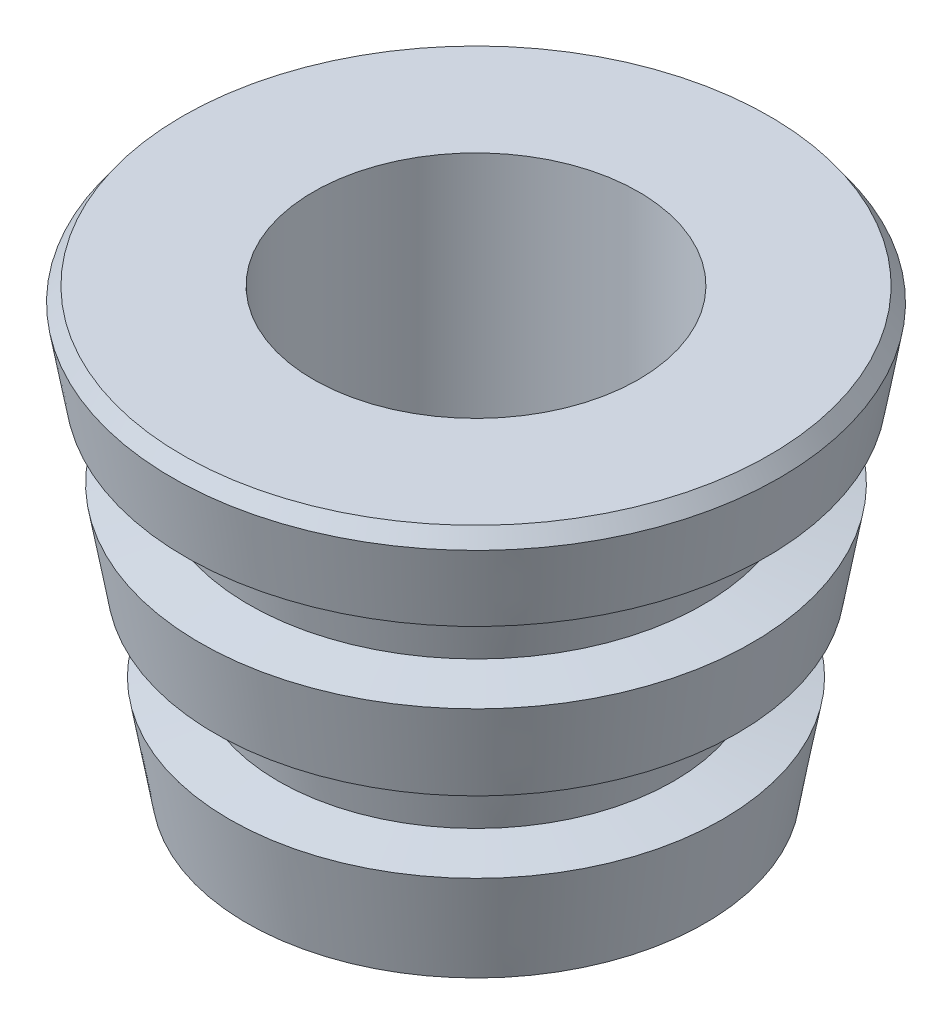
ISO-10303-21;
HEADER;
FILE_DESCRIPTION(('STEP AP214'),'2;1');
FILE_NAME('part.step','',(''),(''),'','','');
FILE_SCHEMA(('AUTOMOTIVE_DESIGN { 1 0 10303 214 1 1 1 1 }'));
ENDSEC;
DATA;
#1=APPLICATION_CONTEXT('core data for automotive mechanical design processes');
#2=APPLICATION_PROTOCOL_DEFINITION('international standard','automotive_design',2000,#1);
#3=PRODUCT_CONTEXT('',#1,'mechanical');
#4=PRODUCT('Part','Part','',(#3));
#5=PRODUCT_RELATED_PRODUCT_CATEGORY('part','',(#4));
#6=PRODUCT_DEFINITION_FORMATION('','',#4);
#7=PRODUCT_DEFINITION_CONTEXT('part definition',#1,'design');
#8=PRODUCT_DEFINITION('design','',#6,#7);
#9=PRODUCT_DEFINITION_SHAPE('','',#8);
#10=(LENGTH_UNIT() NAMED_UNIT(*) SI_UNIT(.MILLI.,.METRE.));
#11=(NAMED_UNIT(*) PLANE_ANGLE_UNIT() SI_UNIT($,.RADIAN.));
#12=(NAMED_UNIT(*) SI_UNIT($,.STERADIAN.) SOLID_ANGLE_UNIT());
#13=UNCERTAINTY_MEASURE_WITH_UNIT(LENGTH_MEASURE(1.E-05),#10,'distance_accuracy_value','');
#14=(GEOMETRIC_REPRESENTATION_CONTEXT(3) GLOBAL_UNCERTAINTY_ASSIGNED_CONTEXT((#13)) GLOBAL_UNIT_ASSIGNED_CONTEXT((#10,
#11,#12)) REPRESENTATION_CONTEXT('',''));
#15=CARTESIAN_POINT('',(0.,0.,0.));
#16=DIRECTION('',(0.,0.,1.));
#17=DIRECTION('',(1.,0.,0.));
#18=AXIS2_PLACEMENT_3D('',#15,#16,#17);
#19=CARTESIAN_POINT('',(0.,0.,0.));
#20=DIRECTION('',(0.,1.,0.));
#21=DIRECTION('',(-1.,0.,0.));
#22=AXIS2_PLACEMENT_3D('',#19,#20,#21);
#23=CONICAL_SURFACE('',#22,10.3596393144852,0.174532925199426);
#24=CARTESIAN_POINT('',(0.,-8.70823082966376,0.));
#25=DIRECTION('',(0.,1.,0.));
#26=DIRECTION('',(-1.,0.,0.));
#27=AXIS2_PLACEMENT_3D('',#24,#25,#26);
#28=CIRCLE('',#27,8.82414326497825);
#29=CARTESIAN_POINT('',(-8.82414326497825,-8.70823082966377,0.));
#30=VERTEX_POINT('',#29);
#31=EDGE_CURVE('E67',#30,#30,#28,.T.);
#32=ORIENTED_EDGE('',*,*,#31,.T.);
#33=EDGE_LOOP('',(#32));
#34=FACE_BOUND('',#33,.T.);
#35=CARTESIAN_POINT('',(0.,-5.79441071848,0.));
#36=DIRECTION('',(0.,1.,0.));
#37=DIRECTION('',(-1.,0.,0.));
#38=AXIS2_PLACEMENT_3D('',#35,#36,#37);
#39=CIRCLE('',#38,9.33792836751087);
#40=CARTESIAN_POINT('',(-9.33792836751087,-5.79441071848,0.));
#41=VERTEX_POINT('',#40);
#42=EDGE_CURVE('E44',#41,#41,#39,.T.);
#43=ORIENTED_EDGE('',*,*,#42,.F.);
#44=EDGE_LOOP('',(#43));
#45=FACE_BOUND('',#44,.T.);
#46=ADVANCED_FACE('F29',(#34,#45),#23,.T.);
#47=CARTESIAN_POINT('',(0.,-5.79441071848,0.));
#48=DIRECTION('',(0.,-1.,0.));
#49=DIRECTION('',(1.,0.,0.));
#50=AXIS2_PLACEMENT_3D('',#47,#48,#49);
#51=CONICAL_SURFACE('',#50,9.33792836751087,1.39626340159547);
#52=CARTESIAN_POINT('',(0.,-5.50268177999957,0.));
#53=DIRECTION('',(0.,1.,0.));
#54=DIRECTION('',(-1.,0.,0.));
#55=AXIS2_PLACEMENT_3D('',#52,#53,#54);
#56=CIRCLE('',#55,7.68345134245036);
#57=CARTESIAN_POINT('',(-7.68345134245036,-5.50268177999957,0.));
#58=VERTEX_POINT('',#57);
#59=EDGE_CURVE('E49',#58,#58,#56,.T.);
#60=ORIENTED_EDGE('',*,*,#59,.F.);
#61=EDGE_LOOP('',(#60));
#62=FACE_BOUND('',#61,.T.);
#63=ORIENTED_EDGE('',*,*,#42,.T.);
#64=EDGE_LOOP('',(#63));
#65=FACE_BOUND('',#64,.T.);
#66=ADVANCED_FACE('F105',(#62,#65),#51,.T.);
#67=CARTESIAN_POINT('',(0.,-5.50268177999957,0.));
#68=DIRECTION('',(0.,1.,0.));
#69=DIRECTION('',(-1.,0.,0.));
#70=AXIS2_PLACEMENT_3D('',#67,#68,#69);
#71=CONICAL_SURFACE('',#70,7.68345134245036,0.174532925199426);
#72=CARTESIAN_POINT('',(0.,-2.74522007156538,0.));
#73=DIRECTION('',(0.,1.,0.));
#74=DIRECTION('',(-1.,0.,0.));
#75=AXIS2_PLACEMENT_3D('',#72,#73,#74);
#76=CIRCLE('',#75,8.16966623991775);
#77=CARTESIAN_POINT('',(-8.16966623991775,-2.74522007156538,0.));
#78=VERTEX_POINT('',#77);
#79=EDGE_CURVE('E52',#78,#78,#76,.T.);
#80=ORIENTED_EDGE('',*,*,#79,.F.);
#81=EDGE_LOOP('',(#80));
#82=FACE_BOUND('',#81,.T.);
#83=ORIENTED_EDGE('',*,*,#59,.T.);
#84=EDGE_LOOP('',(#83));
#85=FACE_BOUND('',#84,.T.);
#86=ADVANCED_FACE('F110',(#82,#85),#71,.T.);
#87=CARTESIAN_POINT('',(0.,-2.74522007156538,0.));
#88=DIRECTION('',(0.,-1.,0.));
#89=DIRECTION('',(1.,0.,0.));
#90=AXIS2_PLACEMENT_3D('',#87,#88,#89);
#91=CONICAL_SURFACE('',#90,8.16966623991775,1.39626340159547);
#92=CARTESIAN_POINT('',(0.,-3.03694901004581,0.));
#93=DIRECTION('',(0.,1.,0.));
#94=DIRECTION('',(-1.,0.,0.));
#95=AXIS2_PLACEMENT_3D('',#92,#93,#94);
#96=CIRCLE('',#95,9.82414326497826);
#97=CARTESIAN_POINT('',(-9.82414326497826,-3.03694901004582,0.));
#98=VERTEX_POINT('',#97);
#99=EDGE_CURVE('E55',#98,#98,#96,.T.);
#100=ORIENTED_EDGE('',*,*,#99,.F.);
#101=EDGE_LOOP('',(#100));
#102=FACE_BOUND('',#101,.T.);
#103=ORIENTED_EDGE('',*,*,#79,.T.);
#104=EDGE_LOOP('',(#103));
#105=FACE_BOUND('',#104,.T.);
#106=ADVANCED_FACE('F135',(#102,#105),#91,.F.);
#107=CARTESIAN_POINT('',(-10.3596393144852,0.,0.));
#108=DIRECTION('',(0.,1.,0.));
#109=DIRECTION('',(-1.,0.,0.));
#110=AXIS2_PLACEMENT_3D('',#107,#108,#109);
#111=PLANE('',#110);
#112=CARTESIAN_POINT('',(0.,0.,0.));
#113=DIRECTION('',(0.,-1.,0.));
#114=DIRECTION('',(1.,0.,0.));
#115=AXIS2_PLACEMENT_3D('',#112,#113,#114);
#116=CIRCLE('',#115,5.5);
#117=CARTESIAN_POINT('',(5.5,0.,0.));
#118=VERTEX_POINT('',#117);
#119=EDGE_CURVE('E70',#118,#118,#116,.T.);
#120=ORIENTED_EDGE('',*,*,#119,.T.);
#121=EDGE_LOOP('',(#120));
#122=FACE_BOUND('',#121,.T.);
#123=CARTESIAN_POINT('',(0.,0.,0.));
#124=DIRECTION('',(0.,1.,0.));
#125=DIRECTION('',(-1.,0.,0.));
#126=AXIS2_PLACEMENT_3D('',#123,#124,#125);
#127=CIRCLE('',#126,9.92803031947846);
#128=CARTESIAN_POINT('',(-9.92803031947846,0.,0.));
#129=VERTEX_POINT('',#128);
#130=EDGE_CURVE('E36',#129,#129,#127,.T.);
#131=ORIENTED_EDGE('',*,*,#130,.T.);
#132=EDGE_LOOP('',(#131));
#133=FACE_BOUND('',#132,.T.);
#134=ADVANCED_FACE('F77',(#122,#133),#111,.T.);
#135=CARTESIAN_POINT('',(0.,-0.492403876506099,0.));
#136=DIRECTION('',(0.,-1.,0.));
#137=DIRECTION('',(1.,0.,0.));
#138=AXIS2_PLACEMENT_3D('',#135,#136,#137);
#139=CIRCLE('',#138,10.2728152256517);
#140=CARTESIAN_POINT('',(10.2728152256517,-0.492403876506098,0.));
#141=VERTEX_POINT('',#140);
#142=EDGE_CURVE('E10',#141,#141,#139,.T.);
#143=ORIENTED_EDGE('',*,*,#142,.T.);
#144=EDGE_LOOP('',(#143));
#145=FACE_BOUND('',#144,.T.);
#146=ORIENTED_EDGE('',*,*,#99,.T.);
#147=EDGE_LOOP('',(#146));
#148=FACE_BOUND('',#147,.T.);
#149=ADVANCED_FACE('F95',(#145,#148),#23,.T.);
#150=CARTESIAN_POINT('',(0.,-8.41650189118333,0.));
#151=DIRECTION('',(0.,-1.,0.));
#152=DIRECTION('',(1.,0.,0.));
#153=AXIS2_PLACEMENT_3D('',#150,#151,#152);
#154=CONICAL_SURFACE('',#153,7.16966623991774,1.39626340159547);
#155=ORIENTED_EDGE('',*,*,#31,.F.);
#156=EDGE_LOOP('',(#155));
#157=FACE_BOUND('',#156,.T.);
#158=CARTESIAN_POINT('',(0.,-8.41650189118333,0.));
#159=DIRECTION('',(0.,1.,0.));
#160=DIRECTION('',(-1.,0.,0.));
#161=AXIS2_PLACEMENT_3D('',#158,#159,#160);
#162=CIRCLE('',#161,7.16966623991774);
#163=CARTESIAN_POINT('',(-7.16966623991774,-8.41650189118333,0.));
#164=VERTEX_POINT('',#163);
#165=EDGE_CURVE('E58',#164,#164,#162,.T.);
#166=ORIENTED_EDGE('',*,*,#165,.T.);
#167=EDGE_LOOP('',(#166));
#168=FACE_BOUND('',#167,.T.);
#169=ADVANCED_FACE('F103',(#157,#168),#154,.F.);
#170=CARTESIAN_POINT('',(0.,-11.1739635996175,0.));
#171=DIRECTION('',(0.,1.,0.));
#172=DIRECTION('',(-1.,0.,0.));
#173=AXIS2_PLACEMENT_3D('',#170,#171,#172);
#174=CONICAL_SURFACE('',#173,6.68345134245036,0.174532925199426);
#175=ORIENTED_EDGE('',*,*,#165,.F.);
#176=EDGE_LOOP('',(#175));
#177=FACE_BOUND('',#176,.T.);
#178=CARTESIAN_POINT('',(0.,-11.1739635996175,0.));
#179=DIRECTION('',(0.,1.,0.));
#180=DIRECTION('',(-1.,0.,0.));
#181=AXIS2_PLACEMENT_3D('',#178,#179,#180);
#182=CIRCLE('',#181,6.68345134245036);
#183=CARTESIAN_POINT('',(-6.68345134245036,-11.1739635996175,0.));
#184=VERTEX_POINT('',#183);
#185=EDGE_CURVE('E61',#184,#184,#182,.T.);
#186=ORIENTED_EDGE('',*,*,#185,.T.);
#187=EDGE_LOOP('',(#186));
#188=FACE_BOUND('',#187,.T.);
#189=ADVANCED_FACE('F120',(#177,#188),#174,.T.);
#190=CARTESIAN_POINT('',(0.,-11.4656925380979,0.));
#191=DIRECTION('',(0.,-1.,0.));
#192=DIRECTION('',(1.,0.,0.));
#193=AXIS2_PLACEMENT_3D('',#190,#191,#192);
#194=CONICAL_SURFACE('',#193,8.33792836751087,1.39626340159547);
#195=ORIENTED_EDGE('',*,*,#185,.F.);
#196=EDGE_LOOP('',(#195));
#197=FACE_BOUND('',#196,.T.);
#198=CARTESIAN_POINT('',(0.,-11.4656925380979,0.));
#199=DIRECTION('',(0.,1.,0.));
#200=DIRECTION('',(-1.,0.,0.));
#201=AXIS2_PLACEMENT_3D('',#198,#199,#200);
#202=CIRCLE('',#201,8.33792836751087);
#203=CARTESIAN_POINT('',(-8.33792836751087,-11.4656925380979,0.));
#204=VERTEX_POINT('',#203);
#205=EDGE_CURVE('E64',#204,#204,#202,.T.);
#206=ORIENTED_EDGE('',*,*,#205,.T.);
#207=EDGE_LOOP('',(#206));
#208=FACE_BOUND('',#207,.T.);
#209=ADVANCED_FACE('F89',(#197,#208),#194,.T.);
#210=CARTESIAN_POINT('',(0.,-14.8,0.));
#211=DIRECTION('',(0.,-1.,0.));
#212=DIRECTION('',(1.,0.,0.));
#213=AXIS2_PLACEMENT_3D('',#210,#211,#212);
#214=PLANE('',#213);
#215=CARTESIAN_POINT('',(0.,-14.8,0.));
#216=DIRECTION('',(0.,-1.,0.));
#217=DIRECTION('',(1.,0.,0.));
#218=AXIS2_PLACEMENT_3D('',#215,#216,#217);
#219=CIRCLE('',#218,5.5);
#220=CARTESIAN_POINT('',(5.5,-14.8,0.));
#221=VERTEX_POINT('',#220);
#222=EDGE_CURVE('E71',#221,#221,#219,.T.);
#223=ORIENTED_EDGE('',*,*,#222,.F.);
#224=EDGE_LOOP('',(#223));
#225=FACE_BOUND('',#224,.T.);
#226=CARTESIAN_POINT('',(0.,-14.8,0.));
#227=DIRECTION('',(0.,1.,0.));
#228=DIRECTION('',(-1.,0.,0.));
#229=AXIS2_PLACEMENT_3D('',#226,#227,#228);
#230=CIRCLE('',#229,7.75);
#231=CARTESIAN_POINT('',(-7.75,-14.8,0.));
#232=VERTEX_POINT('',#231);
#233=EDGE_CURVE('E40',#232,#232,#230,.T.);
#234=ORIENTED_EDGE('',*,*,#233,.F.);
#235=EDGE_LOOP('',(#234));
#236=FACE_BOUND('',#235,.T.);
#237=ADVANCED_FACE('F85',(#225,#236),#214,.T.);
#238=ORIENTED_EDGE('',*,*,#205,.F.);
#239=EDGE_LOOP('',(#238));
#240=FACE_BOUND('',#239,.T.);
#241=ORIENTED_EDGE('',*,*,#233,.T.);
#242=EDGE_LOOP('',(#241));
#243=FACE_BOUND('',#242,.T.);
#244=ADVANCED_FACE('F88',(#240,#243),#23,.T.);
#245=CARTESIAN_POINT('',(0.,0.,0.));
#246=DIRECTION('',(0.,-1.,0.));
#247=DIRECTION('',(1.,0.,0.));
#248=AXIS2_PLACEMENT_3D('',#245,#246,#247);
#249=CONICAL_SURFACE('',#248,9.92803031947846,0.610865238198018);
#250=ORIENTED_EDGE('',*,*,#142,.F.);
#251=EDGE_LOOP('',(#250));
#252=FACE_BOUND('',#251,.T.);
#253=ORIENTED_EDGE('',*,*,#130,.F.);
#254=EDGE_LOOP('',(#253));
#255=FACE_BOUND('',#254,.T.);
#256=ADVANCED_FACE('F31',(#252,#255),#249,.T.);
#257=CARTESIAN_POINT('',(0.,0.,0.));
#258=DIRECTION('',(0.,-1.,0.));
#259=DIRECTION('',(1.,0.,0.));
#260=AXIS2_PLACEMENT_3D('',#257,#258,#259);
#261=CYLINDRICAL_SURFACE('',#260,5.5);
#262=ORIENTED_EDGE('',*,*,#119,.F.);
#263=EDGE_LOOP('',(#262));
#264=FACE_BOUND('',#263,.T.);
#265=ORIENTED_EDGE('',*,*,#222,.T.);
#266=EDGE_LOOP('',(#265));
#267=FACE_BOUND('',#266,.T.);
#268=ADVANCED_FACE('F79',(#264,#267),#261,.F.);
#269=CLOSED_SHELL('',(#46,#66,#86,#106,#134,#149,#169,#189,#209,#237,#244,#256,#268));
#270=MANIFOLD_SOLID_BREP('B2',#269);
#271=ADVANCED_BREP_SHAPE_REPRESENTATION('',(#18,#270),#14);
#272=SHAPE_DEFINITION_REPRESENTATION(#9,#271);
ENDSEC;
END-ISO-10303-21;
